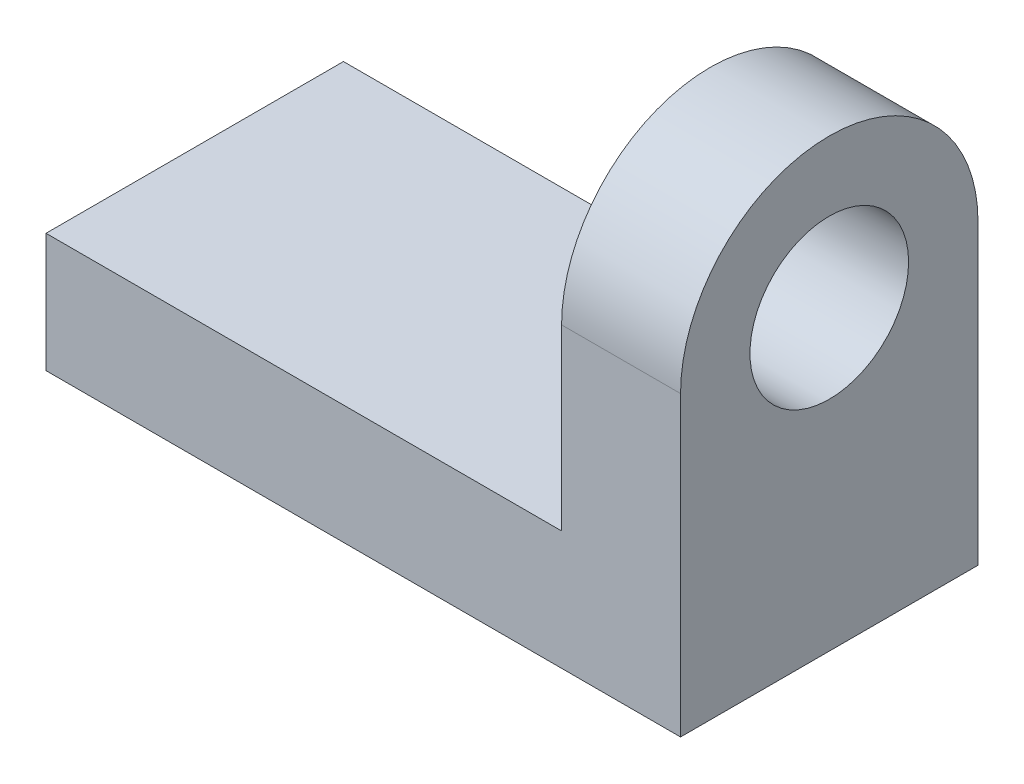
ISO-10303-21;
HEADER;
FILE_DESCRIPTION(('STEP AP214'),'2;1');
FILE_NAME('part.step','',(''),(''),'','','');
FILE_SCHEMA(('AUTOMOTIVE_DESIGN { 1 0 10303 214 1 1 1 1 }'));
ENDSEC;
DATA;
#1=APPLICATION_CONTEXT('core data for automotive mechanical design processes');
#2=APPLICATION_PROTOCOL_DEFINITION('international standard','automotive_design',2000,#1);
#3=PRODUCT_CONTEXT('',#1,'mechanical');
#4=PRODUCT('Part','Part','',(#3));
#5=PRODUCT_RELATED_PRODUCT_CATEGORY('part','',(#4));
#6=PRODUCT_DEFINITION_FORMATION('','',#4);
#7=PRODUCT_DEFINITION_CONTEXT('part definition',#1,'design');
#8=PRODUCT_DEFINITION('design','',#6,#7);
#9=PRODUCT_DEFINITION_SHAPE('','',#8);
#10=(LENGTH_UNIT() NAMED_UNIT(*) SI_UNIT(.MILLI.,.METRE.));
#11=(NAMED_UNIT(*) PLANE_ANGLE_UNIT() SI_UNIT($,.RADIAN.));
#12=(NAMED_UNIT(*) SI_UNIT($,.STERADIAN.) SOLID_ANGLE_UNIT());
#13=UNCERTAINTY_MEASURE_WITH_UNIT(LENGTH_MEASURE(1.E-05),#10,'distance_accuracy_value','');
#14=(GEOMETRIC_REPRESENTATION_CONTEXT(3) GLOBAL_UNCERTAINTY_ASSIGNED_CONTEXT((#13)) GLOBAL_UNIT_ASSIGNED_CONTEXT((#10,
#11,#12)) REPRESENTATION_CONTEXT('',''));
#15=CARTESIAN_POINT('',(0.,0.,0.));
#16=DIRECTION('',(0.,0.,1.));
#17=DIRECTION('',(1.,0.,0.));
#18=AXIS2_PLACEMENT_3D('',#15,#16,#17);
#19=CARTESIAN_POINT('',(-65.,30.,-37.5));
#20=DIRECTION('',(1.,0.,0.));
#21=DIRECTION('',(0.,0.,-1.));
#22=AXIS2_PLACEMENT_3D('',#19,#20,#21);
#23=PLANE('',#22);
#24=DIRECTION('',(0.,0.,1.));
#25=VECTOR('',#24,1.);
#26=CARTESIAN_POINT('',(-65.,0.,-37.5));
#27=LINE('',#26,#25);
#28=CARTESIAN_POINT('',(-65.,0.,-37.5));
#29=VERTEX_POINT('',#28);
#30=CARTESIAN_POINT('',(-65.,0.,37.5));
#31=VERTEX_POINT('',#30);
#32=EDGE_CURVE('E99',#29,#31,#27,.T.);
#33=ORIENTED_EDGE('',*,*,#32,.T.);
#34=DIRECTION('',(0.,-1.,0.));
#35=VECTOR('',#34,1.);
#36=CARTESIAN_POINT('',(-65.,30.,37.5));
#37=LINE('',#36,#35);
#38=CARTESIAN_POINT('',(-65.,30.,37.5));
#39=VERTEX_POINT('',#38);
#40=EDGE_CURVE('E11',#39,#31,#37,.T.);
#41=ORIENTED_EDGE('',*,*,#40,.F.);
#42=DIRECTION('',(0.,0.,1.));
#43=VECTOR('',#42,1.);
#44=CARTESIAN_POINT('',(-65.,30.,-37.5));
#45=LINE('',#44,#43);
#46=CARTESIAN_POINT('',(-65.,30.,-37.5));
#47=VERTEX_POINT('',#46);
#48=EDGE_CURVE('E91',#47,#39,#45,.T.);
#49=ORIENTED_EDGE('',*,*,#48,.F.);
#50=DIRECTION('',(0.,-1.,0.));
#51=VECTOR('',#50,1.);
#52=CARTESIAN_POINT('',(-65.,30.,-37.5));
#53=LINE('',#52,#51);
#54=EDGE_CURVE('E46',#47,#29,#53,.T.);
#55=ORIENTED_EDGE('',*,*,#54,.T.);
#56=EDGE_LOOP('',(#33,#41,#49,#55));
#57=FACE_BOUND('',#56,.T.);
#58=ADVANCED_FACE('F37',(#57),#23,.F.);
#59=CARTESIAN_POINT('',(65.,30.,37.5));
#60=DIRECTION('',(0.,0.,-1.));
#61=DIRECTION('',(-1.,0.,0.));
#62=AXIS2_PLACEMENT_3D('',#59,#60,#61);
#63=PLANE('',#62);
#64=DIRECTION('',(1.,0.,0.));
#65=VECTOR('',#64,1.);
#66=CARTESIAN_POINT('',(65.,0.,37.5));
#67=LINE('',#66,#65);
#68=CARTESIAN_POINT('',(95.,0.,37.5));
#69=VERTEX_POINT('',#68);
#70=EDGE_CURVE('E67',#31,#69,#67,.T.);
#71=ORIENTED_EDGE('',*,*,#70,.T.);
#72=DIRECTION('',(0.,-1.,0.));
#73=VECTOR('',#72,1.);
#74=CARTESIAN_POINT('',(95.,0.,37.5));
#75=LINE('',#74,#73);
#76=CARTESIAN_POINT('',(95.,75.,37.5));
#77=VERTEX_POINT('',#76);
#78=EDGE_CURVE('E117',#77,#69,#75,.T.);
#79=ORIENTED_EDGE('',*,*,#78,.F.);
#80=DIRECTION('',(-1.,0.,0.));
#81=VECTOR('',#80,1.);
#82=CARTESIAN_POINT('',(95.,75.,37.5));
#83=LINE('',#82,#81);
#84=CARTESIAN_POINT('',(65.,75.,37.5));
#85=VERTEX_POINT('',#84);
#86=EDGE_CURVE('E105',#77,#85,#83,.T.);
#87=ORIENTED_EDGE('',*,*,#86,.T.);
#88=DIRECTION('',(0.,-1.,0.));
#89=VECTOR('',#88,1.);
#90=CARTESIAN_POINT('',(65.,0.,37.5));
#91=LINE('',#90,#89);
#92=CARTESIAN_POINT('',(65.,30.,37.5));
#93=VERTEX_POINT('',#92);
#94=EDGE_CURVE('E90',#85,#93,#91,.T.);
#95=ORIENTED_EDGE('',*,*,#94,.T.);
#96=DIRECTION('',(1.,0.,0.));
#97=VECTOR('',#96,1.);
#98=CARTESIAN_POINT('',(65.,30.,37.5));
#99=LINE('',#98,#97);
#100=EDGE_CURVE('E85',#39,#93,#99,.T.);
#101=ORIENTED_EDGE('',*,*,#100,.F.);
#102=ORIENTED_EDGE('',*,*,#40,.T.);
#103=EDGE_LOOP('',(#71,#79,#87,#95,#101,#102));
#104=FACE_BOUND('',#103,.T.);
#105=ADVANCED_FACE('F86',(#104),#63,.F.);
#106=CARTESIAN_POINT('',(65.,30.,-37.5));
#107=DIRECTION('',(0.,0.,1.));
#108=DIRECTION('',(1.,0.,0.));
#109=AXIS2_PLACEMENT_3D('',#106,#107,#108);
#110=PLANE('',#109);
#111=DIRECTION('',(-1.,0.,0.));
#112=VECTOR('',#111,1.);
#113=CARTESIAN_POINT('',(65.,0.,-37.5));
#114=LINE('',#113,#112);
#115=CARTESIAN_POINT('',(95.,0.,-37.5));
#116=VERTEX_POINT('',#115);
#117=EDGE_CURVE('E97',#116,#29,#114,.T.);
#118=ORIENTED_EDGE('',*,*,#117,.T.);
#119=ORIENTED_EDGE('',*,*,#54,.F.);
#120=DIRECTION('',(-1.,0.,0.));
#121=VECTOR('',#120,1.);
#122=CARTESIAN_POINT('',(65.,30.,-37.5));
#123=LINE('',#122,#121);
#124=CARTESIAN_POINT('',(65.,30.,-37.5));
#125=VERTEX_POINT('',#124);
#126=EDGE_CURVE('E54',#125,#47,#123,.T.);
#127=ORIENTED_EDGE('',*,*,#126,.F.);
#128=DIRECTION('',(0.,1.,0.));
#129=VECTOR('',#128,1.);
#130=CARTESIAN_POINT('',(65.,0.,-37.5));
#131=LINE('',#130,#129);
#132=CARTESIAN_POINT('',(65.,75.,-37.5));
#133=VERTEX_POINT('',#132);
#134=EDGE_CURVE('E118',#125,#133,#131,.T.);
#135=ORIENTED_EDGE('',*,*,#134,.T.);
#136=DIRECTION('',(-1.,0.,0.));
#137=VECTOR('',#136,1.);
#138=CARTESIAN_POINT('',(95.,75.,-37.5));
#139=LINE('',#138,#137);
#140=CARTESIAN_POINT('',(95.,75.,-37.5));
#141=VERTEX_POINT('',#140);
#142=EDGE_CURVE('E101',#141,#133,#139,.T.);
#143=ORIENTED_EDGE('',*,*,#142,.F.);
#144=DIRECTION('',(0.,1.,0.));
#145=VECTOR('',#144,1.);
#146=CARTESIAN_POINT('',(95.,0.,-37.5));
#147=LINE('',#146,#145);
#148=EDGE_CURVE('E123',#116,#141,#147,.T.);
#149=ORIENTED_EDGE('',*,*,#148,.F.);
#150=EDGE_LOOP('',(#118,#119,#127,#135,#143,#149));
#151=FACE_BOUND('',#150,.T.);
#152=ADVANCED_FACE('F153',(#151),#110,.F.);
#153=CARTESIAN_POINT('',(0.,30.,0.));
#154=DIRECTION('',(0.,-1.,0.));
#155=DIRECTION('',(0.,0.,-1.));
#156=AXIS2_PLACEMENT_3D('',#153,#154,#155);
#157=PLANE('',#156);
#158=ORIENTED_EDGE('',*,*,#48,.T.);
#159=ORIENTED_EDGE('',*,*,#100,.T.);
#160=DIRECTION('',(0.,0.,-1.));
#161=VECTOR('',#160,1.);
#162=CARTESIAN_POINT('',(65.,30.,-37.5));
#163=LINE('',#162,#161);
#164=EDGE_CURVE('E74',#93,#125,#163,.T.);
#165=ORIENTED_EDGE('',*,*,#164,.T.);
#166=ORIENTED_EDGE('',*,*,#126,.T.);
#167=EDGE_LOOP('',(#158,#159,#165,#166));
#168=FACE_BOUND('',#167,.T.);
#169=ADVANCED_FACE('F94',(#168),#157,.F.);
#170=CARTESIAN_POINT('',(0.,0.,0.));
#171=DIRECTION('',(0.,-1.,0.));
#172=DIRECTION('',(0.,0.,-1.));
#173=AXIS2_PLACEMENT_3D('',#170,#171,#172);
#174=PLANE('',#173);
#175=ORIENTED_EDGE('',*,*,#32,.F.);
#176=ORIENTED_EDGE('',*,*,#117,.F.);
#177=DIRECTION('',(0.,0.,-1.));
#178=VECTOR('',#177,1.);
#179=CARTESIAN_POINT('',(95.,0.,37.5));
#180=LINE('',#179,#178);
#181=EDGE_CURVE('E126',#69,#116,#180,.T.);
#182=ORIENTED_EDGE('',*,*,#181,.F.);
#183=ORIENTED_EDGE('',*,*,#70,.F.);
#184=EDGE_LOOP('',(#175,#176,#182,#183));
#185=FACE_BOUND('',#184,.T.);
#186=ADVANCED_FACE('F160',(#185),#174,.T.);
#187=CARTESIAN_POINT('',(95.,75.,0.));
#188=DIRECTION('',(-1.,0.,0.));
#189=DIRECTION('',(0.,0.,1.));
#190=AXIS2_PLACEMENT_3D('',#187,#188,#189);
#191=CYLINDRICAL_SURFACE('',#190,37.5);
#192=CARTESIAN_POINT('',(65.,75.,0.));
#193=DIRECTION('',(1.,0.,0.));
#194=DIRECTION('',(0.,0.,-1.));
#195=AXIS2_PLACEMENT_3D('',#192,#193,#194);
#196=CIRCLE('',#195,37.5);
#197=EDGE_CURVE('E114',#133,#85,#196,.T.);
#198=ORIENTED_EDGE('',*,*,#197,.T.);
#199=ORIENTED_EDGE('',*,*,#86,.F.);
#200=CARTESIAN_POINT('',(95.,75.,0.));
#201=DIRECTION('',(1.,0.,0.));
#202=DIRECTION('',(0.,0.,-1.));
#203=AXIS2_PLACEMENT_3D('',#200,#201,#202);
#204=CIRCLE('',#203,37.5);
#205=EDGE_CURVE('E113',#141,#77,#204,.T.);
#206=ORIENTED_EDGE('',*,*,#205,.F.);
#207=ORIENTED_EDGE('',*,*,#142,.T.);
#208=EDGE_LOOP('',(#198,#199,#206,#207));
#209=FACE_BOUND('',#208,.T.);
#210=ADVANCED_FACE('F163',(#209),#191,.T.);
#211=CARTESIAN_POINT('',(95.,75.,0.));
#212=DIRECTION('',(1.,0.,0.));
#213=DIRECTION('',(0.,0.,-1.));
#214=AXIS2_PLACEMENT_3D('',#211,#212,#213);
#215=PLANE('',#214);
#216=CARTESIAN_POINT('',(95.,75.,0.));
#217=DIRECTION('',(1.,0.,0.));
#218=DIRECTION('',(0.,0.,-1.));
#219=AXIS2_PLACEMENT_3D('',#216,#217,#218);
#220=CIRCLE('',#219,20.);
#221=CARTESIAN_POINT('',(95.,75.,-20.));
#222=VERTEX_POINT('',#221);
#223=EDGE_CURVE('E131',#222,#222,#220,.T.);
#224=ORIENTED_EDGE('',*,*,#223,.F.);
#225=EDGE_LOOP('',(#224));
#226=FACE_BOUND('',#225,.T.);
#227=ORIENTED_EDGE('',*,*,#78,.T.);
#228=ORIENTED_EDGE('',*,*,#181,.T.);
#229=ORIENTED_EDGE('',*,*,#148,.T.);
#230=ORIENTED_EDGE('',*,*,#205,.T.);
#231=EDGE_LOOP('',(#227,#228,#229,#230));
#232=FACE_BOUND('',#231,.T.);
#233=ADVANCED_FACE('F146',(#226,#232),#215,.T.);
#234=CARTESIAN_POINT('',(65.,75.,0.));
#235=DIRECTION('',(1.,0.,0.));
#236=DIRECTION('',(0.,0.,-1.));
#237=AXIS2_PLACEMENT_3D('',#234,#235,#236);
#238=PLANE('',#237);
#239=CARTESIAN_POINT('',(65.,75.,0.));
#240=DIRECTION('',(1.,0.,0.));
#241=DIRECTION('',(0.,0.,-1.));
#242=AXIS2_PLACEMENT_3D('',#239,#240,#241);
#243=CIRCLE('',#242,20.);
#244=CARTESIAN_POINT('',(65.,75.,-20.));
#245=VERTEX_POINT('',#244);
#246=EDGE_CURVE('E40',#245,#245,#243,.T.);
#247=ORIENTED_EDGE('',*,*,#246,.T.);
#248=EDGE_LOOP('',(#247));
#249=FACE_BOUND('',#248,.T.);
#250=ORIENTED_EDGE('',*,*,#164,.F.);
#251=ORIENTED_EDGE('',*,*,#94,.F.);
#252=ORIENTED_EDGE('',*,*,#197,.F.);
#253=ORIENTED_EDGE('',*,*,#134,.F.);
#254=EDGE_LOOP('',(#250,#251,#252,#253));
#255=FACE_BOUND('',#254,.T.);
#256=ADVANCED_FACE('F138',(#249,#255),#238,.F.);
#257=CARTESIAN_POINT('',(33.,75.,0.));
#258=DIRECTION('',(1.,0.,0.));
#259=DIRECTION('',(0.,0.,-1.));
#260=AXIS2_PLACEMENT_3D('',#257,#258,#259);
#261=CYLINDRICAL_SURFACE('',#260,20.);
#262=ORIENTED_EDGE('',*,*,#223,.T.);
#263=EDGE_LOOP('',(#262));
#264=FACE_BOUND('',#263,.T.);
#265=ORIENTED_EDGE('',*,*,#246,.F.);
#266=EDGE_LOOP('',(#265));
#267=FACE_BOUND('',#266,.T.);
#268=ADVANCED_FACE('F140',(#264,#267),#261,.F.);
#269=CLOSED_SHELL('',(#58,#105,#152,#169,#186,#210,#233,#256,#268));
#270=MANIFOLD_SOLID_BREP('B2',#269);
#271=ADVANCED_BREP_SHAPE_REPRESENTATION('',(#18,#270),#14);
#272=SHAPE_DEFINITION_REPRESENTATION(#9,#271);
ENDSEC;
END-ISO-10303-21;
